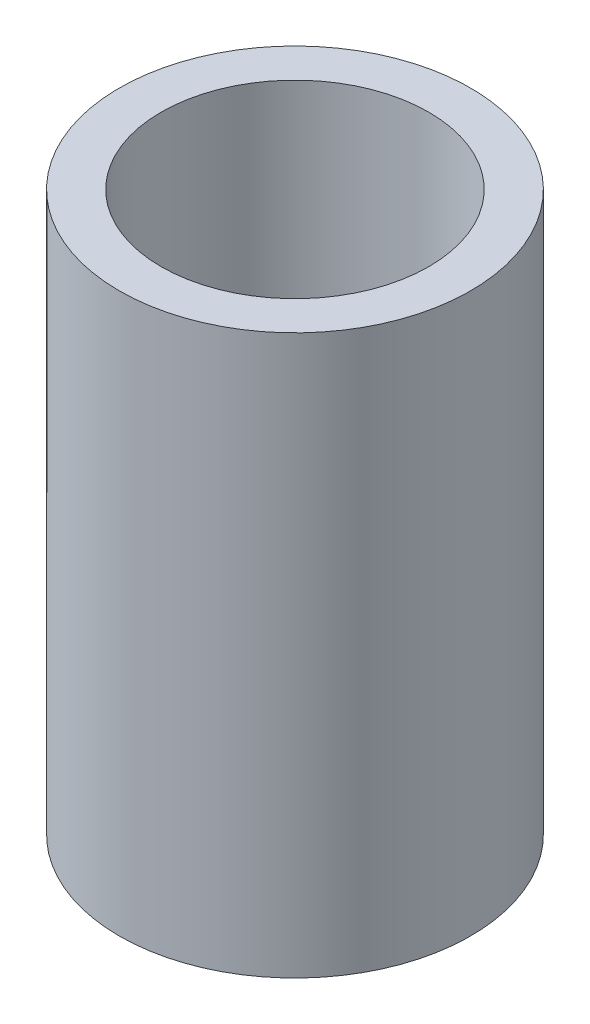
ISO-10303-21;
HEADER;
FILE_DESCRIPTION(('STEP AP214'),'2;1');
FILE_NAME('part.step','',(''),(''),'','','');
FILE_SCHEMA(('AUTOMOTIVE_DESIGN { 1 0 10303 214 1 1 1 1 }'));
ENDSEC;
DATA;
#1=APPLICATION_CONTEXT('core data for automotive mechanical design processes');
#2=APPLICATION_PROTOCOL_DEFINITION('international standard','automotive_design',2000,#1);
#3=PRODUCT_CONTEXT('',#1,'mechanical');
#4=PRODUCT('Part','Part','',(#3));
#5=PRODUCT_RELATED_PRODUCT_CATEGORY('part','',(#4));
#6=PRODUCT_DEFINITION_FORMATION('','',#4);
#7=PRODUCT_DEFINITION_CONTEXT('part definition',#1,'design');
#8=PRODUCT_DEFINITION('design','',#6,#7);
#9=PRODUCT_DEFINITION_SHAPE('','',#8);
#10=(LENGTH_UNIT() NAMED_UNIT(*) SI_UNIT(.MILLI.,.METRE.));
#11=(NAMED_UNIT(*) PLANE_ANGLE_UNIT() SI_UNIT($,.RADIAN.));
#12=(NAMED_UNIT(*) SI_UNIT($,.STERADIAN.) SOLID_ANGLE_UNIT());
#13=UNCERTAINTY_MEASURE_WITH_UNIT(LENGTH_MEASURE(1.E-05),#10,'distance_accuracy_value','');
#14=(GEOMETRIC_REPRESENTATION_CONTEXT(3) GLOBAL_UNCERTAINTY_ASSIGNED_CONTEXT((#13)) GLOBAL_UNIT_ASSIGNED_CONTEXT((#10,
#11,#12)) REPRESENTATION_CONTEXT('',''));
#15=CARTESIAN_POINT('',(0.,0.,0.));
#16=DIRECTION('',(0.,0.,1.));
#17=DIRECTION('',(1.,0.,0.));
#18=AXIS2_PLACEMENT_3D('',#15,#16,#17);
#19=CARTESIAN_POINT('',(0.,167.,0.));
#20=DIRECTION('',(0.,-1.,0.));
#21=DIRECTION('',(0.,0.,-1.));
#22=AXIS2_PLACEMENT_3D('',#19,#20,#21);
#23=CYLINDRICAL_SURFACE('',#22,40.);
#24=CARTESIAN_POINT('',(0.,167.,0.));
#25=DIRECTION('',(0.,1.,0.));
#26=DIRECTION('',(0.,0.,1.));
#27=AXIS2_PLACEMENT_3D('',#24,#25,#26);
#28=CIRCLE('',#27,40.);
#29=CARTESIAN_POINT('',(0.,167.,40.));
#30=VERTEX_POINT('',#29);
#31=EDGE_CURVE('E54',#30,#30,#28,.T.);
#32=ORIENTED_EDGE('',*,*,#31,.T.);
#33=EDGE_LOOP('',(#32));
#34=FACE_BOUND('',#33,.T.);
#35=CARTESIAN_POINT('',(0.,5.,0.));
#36=DIRECTION('',(0.,-1.,0.));
#37=DIRECTION('',(0.,0.,-1.));
#38=AXIS2_PLACEMENT_3D('',#35,#36,#37);
#39=CIRCLE('',#38,40.);
#40=CARTESIAN_POINT('',(0.,5.,-40.));
#41=VERTEX_POINT('',#40);
#42=EDGE_CURVE('E43',#41,#41,#39,.T.);
#43=ORIENTED_EDGE('',*,*,#42,.T.);
#44=EDGE_LOOP('',(#43));
#45=FACE_BOUND('',#44,.T.);
#46=ADVANCED_FACE('F39',(#34,#45),#23,.F.);
#47=CARTESIAN_POINT('',(0.,167.,0.));
#48=DIRECTION('',(0.,1.,0.));
#49=DIRECTION('',(0.,0.,1.));
#50=AXIS2_PLACEMENT_3D('',#47,#48,#49);
#51=PLANE('',#50);
#52=CARTESIAN_POINT('',(0.,167.,0.));
#53=DIRECTION('',(0.,1.,0.));
#54=DIRECTION('',(0.,0.,1.));
#55=AXIS2_PLACEMENT_3D('',#52,#53,#54);
#56=CIRCLE('',#55,52.5);
#57=CARTESIAN_POINT('',(0.,167.,52.5));
#58=VERTEX_POINT('',#57);
#59=EDGE_CURVE('E10',#58,#58,#56,.T.);
#60=ORIENTED_EDGE('',*,*,#59,.T.);
#61=EDGE_LOOP('',(#60));
#62=FACE_BOUND('',#61,.T.);
#63=ORIENTED_EDGE('',*,*,#31,.F.);
#64=EDGE_LOOP('',(#63));
#65=FACE_BOUND('',#64,.T.);
#66=ADVANCED_FACE('F75',(#62,#65),#51,.T.);
#67=CARTESIAN_POINT('',(0.,0.,0.));
#68=DIRECTION('',(0.,1.,0.));
#69=DIRECTION('',(0.,0.,1.));
#70=AXIS2_PLACEMENT_3D('',#67,#68,#69);
#71=PLANE('',#70);
#72=CARTESIAN_POINT('',(0.,0.,0.));
#73=DIRECTION('',(0.,1.,0.));
#74=DIRECTION('',(0.,0.,1.));
#75=AXIS2_PLACEMENT_3D('',#72,#73,#74);
#76=CIRCLE('',#75,52.5);
#77=CARTESIAN_POINT('',(0.,0.,52.5));
#78=VERTEX_POINT('',#77);
#79=EDGE_CURVE('E48',#78,#78,#76,.T.);
#80=ORIENTED_EDGE('',*,*,#79,.F.);
#81=EDGE_LOOP('',(#80));
#82=FACE_BOUND('',#81,.T.);
#83=ADVANCED_FACE('F71',(#82),#71,.F.);
#84=CARTESIAN_POINT('',(0.,167.,0.));
#85=DIRECTION('',(0.,-1.,0.));
#86=DIRECTION('',(0.,0.,-1.));
#87=AXIS2_PLACEMENT_3D('',#84,#85,#86);
#88=CYLINDRICAL_SURFACE('',#87,52.5);
#89=ORIENTED_EDGE('',*,*,#79,.T.);
#90=EDGE_LOOP('',(#89));
#91=FACE_BOUND('',#90,.T.);
#92=ORIENTED_EDGE('',*,*,#59,.F.);
#93=EDGE_LOOP('',(#92));
#94=FACE_BOUND('',#93,.T.);
#95=ADVANCED_FACE('F41',(#91,#94),#88,.T.);
#96=CARTESIAN_POINT('',(0.,5.,0.));
#97=DIRECTION('',(0.,-1.,0.));
#98=DIRECTION('',(0.,0.,-1.));
#99=AXIS2_PLACEMENT_3D('',#96,#97,#98);
#100=PLANE('',#99);
#101=ORIENTED_EDGE('',*,*,#42,.F.);
#102=EDGE_LOOP('',(#101));
#103=FACE_BOUND('',#102,.T.);
#104=ADVANCED_FACE('F65',(#103),#100,.F.);
#105=CLOSED_SHELL('',(#46,#66,#83,#95,#104));
#106=MANIFOLD_SOLID_BREP('B2',#105);
#107=ADVANCED_BREP_SHAPE_REPRESENTATION('',(#18,#106),#14);
#108=SHAPE_DEFINITION_REPRESENTATION(#9,#107);
ENDSEC;
END-ISO-10303-21;
